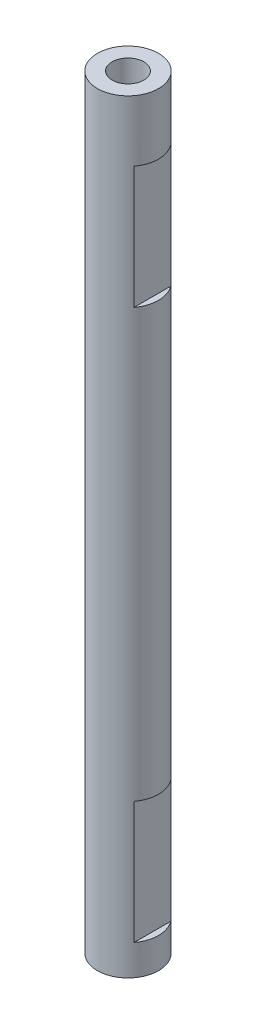
ISO-10303-21;
HEADER;
FILE_DESCRIPTION(('STEP AP214'),'2;1');
FILE_NAME('part.step','',(''),(''),'','','');
FILE_SCHEMA(('AUTOMOTIVE_DESIGN { 1 0 10303 214 1 1 1 1 }'));
ENDSEC;
DATA;
#1=APPLICATION_CONTEXT('core data for automotive mechanical design processes');
#2=APPLICATION_PROTOCOL_DEFINITION('international standard','automotive_design',2000,#1);
#3=PRODUCT_CONTEXT('',#1,'mechanical');
#4=PRODUCT('Part','Part','',(#3));
#5=PRODUCT_RELATED_PRODUCT_CATEGORY('part','',(#4));
#6=PRODUCT_DEFINITION_FORMATION('','',#4);
#7=PRODUCT_DEFINITION_CONTEXT('part definition',#1,'design');
#8=PRODUCT_DEFINITION('design','',#6,#7);
#9=PRODUCT_DEFINITION_SHAPE('','',#8);
#10=(LENGTH_UNIT() NAMED_UNIT(*) SI_UNIT(.MILLI.,.METRE.));
#11=(NAMED_UNIT(*) PLANE_ANGLE_UNIT() SI_UNIT($,.RADIAN.));
#12=(NAMED_UNIT(*) SI_UNIT($,.STERADIAN.) SOLID_ANGLE_UNIT());
#13=UNCERTAINTY_MEASURE_WITH_UNIT(LENGTH_MEASURE(1.E-05),#10,'distance_accuracy_value','');
#14=(GEOMETRIC_REPRESENTATION_CONTEXT(3) GLOBAL_UNCERTAINTY_ASSIGNED_CONTEXT((#13)) GLOBAL_UNIT_ASSIGNED_CONTEXT((#10,
#11,#12)) REPRESENTATION_CONTEXT('',''));
#15=CARTESIAN_POINT('',(0.,0.,0.));
#16=DIRECTION('',(0.,0.,1.));
#17=DIRECTION('',(1.,0.,0.));
#18=AXIS2_PLACEMENT_3D('',#15,#16,#17);
#19=CARTESIAN_POINT('',(0.,125.,0.));
#20=DIRECTION('',(0.,-1.,0.));
#21=DIRECTION('',(0.,0.,-1.));
#22=AXIS2_PLACEMENT_3D('',#19,#20,#21);
#23=CYLINDRICAL_SURFACE('',#22,5.);
#24=CARTESIAN_POINT('',(0.,25.,0.));
#25=DIRECTION('',(0.,-1.,0.));
#26=DIRECTION('',(0.,0.,-1.));
#27=AXIS2_PLACEMENT_3D('',#24,#25,#26);
#28=CIRCLE('',#27,5.);
#29=CARTESIAN_POINT('',(4.,25.,-3.));
#30=VERTEX_POINT('',#29);
#31=CARTESIAN_POINT('',(4.,25.,3.));
#32=VERTEX_POINT('',#31);
#33=EDGE_CURVE('E125',#30,#32,#28,.T.);
#34=ORIENTED_EDGE('',*,*,#33,.F.);
#35=DIRECTION('',(0.,-1.,0.));
#36=VECTOR('',#35,1.);
#37=CARTESIAN_POINT('',(4.,25.,-3.));
#38=LINE('',#37,#36);
#39=CARTESIAN_POINT('',(4.,5.,-3.));
#40=VERTEX_POINT('',#39);
#41=EDGE_CURVE('E134',#30,#40,#38,.T.);
#42=ORIENTED_EDGE('',*,*,#41,.T.);
#43=CARTESIAN_POINT('',(0.,5.,0.));
#44=DIRECTION('',(0.,-1.,0.));
#45=DIRECTION('',(0.,0.,-1.));
#46=AXIS2_PLACEMENT_3D('',#43,#44,#45);
#47=CIRCLE('',#46,5.);
#48=CARTESIAN_POINT('',(4.,5.,3.));
#49=VERTEX_POINT('',#48);
#50=EDGE_CURVE('E123',#40,#49,#47,.T.);
#51=ORIENTED_EDGE('',*,*,#50,.T.);
#52=DIRECTION('',(0.,-1.,0.));
#53=VECTOR('',#52,1.);
#54=CARTESIAN_POINT('',(4.,25.,3.));
#55=LINE('',#54,#53);
#56=EDGE_CURVE('E130',#32,#49,#55,.T.);
#57=ORIENTED_EDGE('',*,*,#56,.F.);
#58=EDGE_LOOP('',(#34,#42,#51,#57));
#59=FACE_BOUND('',#58,.T.);
#60=CARTESIAN_POINT('',(0.,95.,0.));
#61=DIRECTION('',(0.,1.,0.));
#62=DIRECTION('',(0.,0.,1.));
#63=AXIS2_PLACEMENT_3D('',#60,#61,#62);
#64=CIRCLE('',#63,5.);
#65=CARTESIAN_POINT('',(4.,95.,-3.00000000000001));
#66=VERTEX_POINT('',#65);
#67=CARTESIAN_POINT('',(4.,95.,3.00000000000001));
#68=VERTEX_POINT('',#67);
#69=EDGE_CURVE('E155',#66,#68,#64,.F.);
#70=ORIENTED_EDGE('',*,*,#69,.T.);
#71=DIRECTION('',(0.,1.,0.));
#72=VECTOR('',#71,1.);
#73=CARTESIAN_POINT('',(4.,95.,3.00000000000001));
#74=LINE('',#73,#72);
#75=CARTESIAN_POINT('',(4.,115.,3.00000000000001));
#76=VERTEX_POINT('',#75);
#77=EDGE_CURVE('E166',#68,#76,#74,.T.);
#78=ORIENTED_EDGE('',*,*,#77,.T.);
#79=CARTESIAN_POINT('',(0.,115.,0.));
#80=DIRECTION('',(0.,1.,0.));
#81=DIRECTION('',(0.,0.,1.));
#82=AXIS2_PLACEMENT_3D('',#79,#80,#81);
#83=CIRCLE('',#82,5.);
#84=CARTESIAN_POINT('',(4.,115.,-3.00000000000001));
#85=VERTEX_POINT('',#84);
#86=EDGE_CURVE('E152',#85,#76,#83,.F.);
#87=ORIENTED_EDGE('',*,*,#86,.F.);
#88=DIRECTION('',(0.,1.,0.));
#89=VECTOR('',#88,1.);
#90=CARTESIAN_POINT('',(4.,95.,-3.00000000000001));
#91=LINE('',#90,#89);
#92=EDGE_CURVE('E161',#66,#85,#91,.T.);
#93=ORIENTED_EDGE('',*,*,#92,.F.);
#94=EDGE_LOOP('',(#70,#78,#87,#93));
#95=FACE_BOUND('',#94,.T.);
#96=CARTESIAN_POINT('',(0.,125.,0.));
#97=DIRECTION('',(0.,1.,0.));
#98=DIRECTION('',(0.,0.,1.));
#99=AXIS2_PLACEMENT_3D('',#96,#97,#98);
#100=CIRCLE('',#99,5.);
#101=CARTESIAN_POINT('',(0.,125.,5.));
#102=VERTEX_POINT('',#101);
#103=EDGE_CURVE('E11',#102,#102,#100,.T.);
#104=ORIENTED_EDGE('',*,*,#103,.F.);
#105=EDGE_LOOP('',(#104));
#106=FACE_BOUND('',#105,.T.);
#107=CARTESIAN_POINT('',(0.,0.,0.));
#108=DIRECTION('',(0.,1.,0.));
#109=DIRECTION('',(0.,0.,1.));
#110=AXIS2_PLACEMENT_3D('',#107,#108,#109);
#111=CIRCLE('',#110,5.);
#112=CARTESIAN_POINT('',(0.,0.,5.));
#113=VERTEX_POINT('',#112);
#114=EDGE_CURVE('E37',#113,#113,#111,.T.);
#115=ORIENTED_EDGE('',*,*,#114,.T.);
#116=EDGE_LOOP('',(#115));
#117=FACE_BOUND('',#116,.T.);
#118=CARTESIAN_POINT('',(0.,95.,0.));
#119=DIRECTION('',(0.,1.,0.));
#120=DIRECTION('',(0.,0.,1.));
#121=AXIS2_PLACEMENT_3D('',#118,#119,#120);
#122=CIRCLE('',#121,5.);
#123=CARTESIAN_POINT('',(-4.,95.,-2.99999999999999));
#124=VERTEX_POINT('',#123);
#125=CARTESIAN_POINT('',(-4.,95.,2.99999999999999));
#126=VERTEX_POINT('',#125);
#127=EDGE_CURVE('E139',#124,#126,#122,.T.);
#128=ORIENTED_EDGE('',*,*,#127,.F.);
#129=DIRECTION('',(0.,1.,0.));
#130=VECTOR('',#129,1.);
#131=CARTESIAN_POINT('',(-4.,95.,-2.99999999999999));
#132=LINE('',#131,#130);
#133=CARTESIAN_POINT('',(-4.,115.,-2.99999999999999));
#134=VERTEX_POINT('',#133);
#135=EDGE_CURVE('E149',#124,#134,#132,.T.);
#136=ORIENTED_EDGE('',*,*,#135,.T.);
#137=CARTESIAN_POINT('',(0.,115.,0.));
#138=DIRECTION('',(0.,1.,0.));
#139=DIRECTION('',(0.,0.,1.));
#140=AXIS2_PLACEMENT_3D('',#137,#138,#139);
#141=CIRCLE('',#140,5.);
#142=CARTESIAN_POINT('',(-4.,115.,2.99999999999999));
#143=VERTEX_POINT('',#142);
#144=EDGE_CURVE('E137',#134,#143,#141,.T.);
#145=ORIENTED_EDGE('',*,*,#144,.T.);
#146=DIRECTION('',(0.,1.,0.));
#147=VECTOR('',#146,1.);
#148=CARTESIAN_POINT('',(-4.,95.,2.99999999999999));
#149=LINE('',#148,#147);
#150=EDGE_CURVE('E145',#126,#143,#149,.T.);
#151=ORIENTED_EDGE('',*,*,#150,.F.);
#152=EDGE_LOOP('',(#128,#136,#145,#151));
#153=FACE_BOUND('',#152,.T.);
#154=CARTESIAN_POINT('',(0.,25.,0.));
#155=DIRECTION('',(0.,-1.,0.));
#156=DIRECTION('',(0.,0.,-1.));
#157=AXIS2_PLACEMENT_3D('',#154,#155,#156);
#158=CIRCLE('',#157,5.);
#159=CARTESIAN_POINT('',(-4.,25.,-3.));
#160=VERTEX_POINT('',#159);
#161=CARTESIAN_POINT('',(-4.,25.,3.));
#162=VERTEX_POINT('',#161);
#163=EDGE_CURVE('E113',#160,#162,#158,.F.);
#164=ORIENTED_EDGE('',*,*,#163,.T.);
#165=DIRECTION('',(0.,-1.,0.));
#166=VECTOR('',#165,1.);
#167=CARTESIAN_POINT('',(-4.,25.,3.));
#168=LINE('',#167,#166);
#169=CARTESIAN_POINT('',(-4.,5.,3.));
#170=VERTEX_POINT('',#169);
#171=EDGE_CURVE('E104',#162,#170,#168,.T.);
#172=ORIENTED_EDGE('',*,*,#171,.T.);
#173=CARTESIAN_POINT('',(0.,5.,0.));
#174=DIRECTION('',(0.,-1.,0.));
#175=DIRECTION('',(0.,0.,-1.));
#176=AXIS2_PLACEMENT_3D('',#173,#174,#175);
#177=CIRCLE('',#176,5.);
#178=CARTESIAN_POINT('',(-4.,5.,-3.));
#179=VERTEX_POINT('',#178);
#180=EDGE_CURVE('E117',#179,#170,#177,.F.);
#181=ORIENTED_EDGE('',*,*,#180,.F.);
#182=DIRECTION('',(0.,-1.,0.));
#183=VECTOR('',#182,1.);
#184=CARTESIAN_POINT('',(-4.,25.,-3.));
#185=LINE('',#184,#183);
#186=EDGE_CURVE('E112',#160,#179,#185,.T.);
#187=ORIENTED_EDGE('',*,*,#186,.F.);
#188=EDGE_LOOP('',(#164,#172,#181,#187));
#189=FACE_BOUND('',#188,.T.);
#190=ADVANCED_FACE('F34',(#59,#95,#106,#117,#153,#189),#23,.T.);
#191=CARTESIAN_POINT('',(0.,125.,0.));
#192=DIRECTION('',(0.,1.,0.));
#193=DIRECTION('',(0.,0.,1.));
#194=AXIS2_PLACEMENT_3D('',#191,#192,#193);
#195=PLANE('',#194);
#196=CARTESIAN_POINT('',(0.,125.,0.));
#197=DIRECTION('',(0.,1.,0.));
#198=DIRECTION('',(0.,0.,1.));
#199=AXIS2_PLACEMENT_3D('',#196,#197,#198);
#200=CIRCLE('',#199,2.6);
#201=CARTESIAN_POINT('',(0.,125.,2.6));
#202=VERTEX_POINT('',#201);
#203=EDGE_CURVE('E176',#202,#202,#200,.T.);
#204=ORIENTED_EDGE('',*,*,#203,.F.);
#205=EDGE_LOOP('',(#204));
#206=FACE_BOUND('',#205,.T.);
#207=ORIENTED_EDGE('',*,*,#103,.T.);
#208=EDGE_LOOP('',(#207));
#209=FACE_BOUND('',#208,.T.);
#210=ADVANCED_FACE('F191',(#206,#209),#195,.T.);
#211=CARTESIAN_POINT('',(0.,0.,0.));
#212=DIRECTION('',(0.,1.,0.));
#213=DIRECTION('',(0.,0.,1.));
#214=AXIS2_PLACEMENT_3D('',#211,#212,#213);
#215=PLANE('',#214);
#216=CARTESIAN_POINT('',(0.,0.,0.));
#217=DIRECTION('',(0.,-1.,0.));
#218=DIRECTION('',(0.,0.,-1.));
#219=AXIS2_PLACEMENT_3D('',#216,#217,#218);
#220=CIRCLE('',#219,2.59999999999999);
#221=CARTESIAN_POINT('',(0.,0.,-2.59999999999999));
#222=VERTEX_POINT('',#221);
#223=EDGE_CURVE('E169',#222,#222,#220,.T.);
#224=ORIENTED_EDGE('',*,*,#223,.F.);
#225=EDGE_LOOP('',(#224));
#226=FACE_BOUND('',#225,.T.);
#227=ORIENTED_EDGE('',*,*,#114,.F.);
#228=EDGE_LOOP('',(#227));
#229=FACE_BOUND('',#228,.T.);
#230=ADVANCED_FACE('F188',(#226,#229),#215,.F.);
#231=CARTESIAN_POINT('',(0.,109.,0.));
#232=DIRECTION('',(0.,1.,0.));
#233=DIRECTION('',(0.,0.,1.));
#234=AXIS2_PLACEMENT_3D('',#231,#232,#233);
#235=CONICAL_SURFACE('',#234,2.6,1.02974425867665);
#236=CARTESIAN_POINT('',(0.,107.437762390528,0.));
#237=VERTEX_POINT('',#236);
#238=VERTEX_LOOP('',#237);
#239=FACE_BOUND('',#238,.T.);
#240=CARTESIAN_POINT('',(0.,109.,0.));
#241=DIRECTION('',(0.,1.,0.));
#242=DIRECTION('',(0.,0.,1.));
#243=AXIS2_PLACEMENT_3D('',#240,#241,#242);
#244=CIRCLE('',#243,2.6);
#245=CARTESIAN_POINT('',(0.,109.,2.6));
#246=VERTEX_POINT('',#245);
#247=EDGE_CURVE('E179',#246,#246,#244,.T.);
#248=ORIENTED_EDGE('',*,*,#247,.T.);
#249=EDGE_LOOP('',(#248));
#250=FACE_BOUND('',#249,.T.);
#251=ADVANCED_FACE('F190',(#239,#250),#235,.F.);
#252=CARTESIAN_POINT('',(0.,125.,0.));
#253=DIRECTION('',(0.,1.,0.));
#254=DIRECTION('',(0.,0.,1.));
#255=AXIS2_PLACEMENT_3D('',#252,#253,#254);
#256=CYLINDRICAL_SURFACE('',#255,2.6);
#257=ORIENTED_EDGE('',*,*,#247,.F.);
#258=EDGE_LOOP('',(#257));
#259=FACE_BOUND('',#258,.T.);
#260=ORIENTED_EDGE('',*,*,#203,.T.);
#261=EDGE_LOOP('',(#260));
#262=FACE_BOUND('',#261,.T.);
#263=ADVANCED_FACE('F197',(#259,#262),#256,.F.);
#264=CARTESIAN_POINT('',(0.,16.,0.));
#265=DIRECTION('',(0.,-1.,0.));
#266=DIRECTION('',(0.,0.,-1.));
#267=AXIS2_PLACEMENT_3D('',#264,#265,#266);
#268=CONICAL_SURFACE('',#267,2.59999999999999,1.02974425867665);
#269=CARTESIAN_POINT('',(0.,17.5622376094716,0.));
#270=VERTEX_POINT('',#269);
#271=VERTEX_LOOP('',#270);
#272=FACE_BOUND('',#271,.T.);
#273=CARTESIAN_POINT('',(0.,16.,0.));
#274=DIRECTION('',(0.,-1.,0.));
#275=DIRECTION('',(0.,0.,-1.));
#276=AXIS2_PLACEMENT_3D('',#273,#274,#275);
#277=CIRCLE('',#276,2.59999999999999);
#278=CARTESIAN_POINT('',(0.,16.,-2.59999999999999));
#279=VERTEX_POINT('',#278);
#280=EDGE_CURVE('E173',#279,#279,#277,.T.);
#281=ORIENTED_EDGE('',*,*,#280,.T.);
#282=EDGE_LOOP('',(#281));
#283=FACE_BOUND('',#282,.T.);
#284=ADVANCED_FACE('F240',(#272,#283),#268,.F.);
#285=CARTESIAN_POINT('',(0.,0.,0.));
#286=DIRECTION('',(0.,-1.,0.));
#287=DIRECTION('',(0.,0.,-1.));
#288=AXIS2_PLACEMENT_3D('',#285,#286,#287);
#289=CYLINDRICAL_SURFACE('',#288,2.59999999999999);
#290=ORIENTED_EDGE('',*,*,#280,.F.);
#291=EDGE_LOOP('',(#290));
#292=FACE_BOUND('',#291,.T.);
#293=ORIENTED_EDGE('',*,*,#223,.T.);
#294=EDGE_LOOP('',(#293));
#295=FACE_BOUND('',#294,.T.);
#296=ADVANCED_FACE('F237',(#292,#295),#289,.F.);
#297=CARTESIAN_POINT('',(4.,95.,0.));
#298=DIRECTION('',(1.,0.,0.));
#299=DIRECTION('',(0.,0.,-1.));
#300=AXIS2_PLACEMENT_3D('',#297,#298,#299);
#301=PLANE('',#300);
#302=DIRECTION('',(0.,0.,-1.));
#303=VECTOR('',#302,1.);
#304=CARTESIAN_POINT('',(4.,115.,0.));
#305=LINE('',#304,#303);
#306=EDGE_CURVE('E159',#76,#85,#305,.T.);
#307=ORIENTED_EDGE('',*,*,#306,.F.);
#308=ORIENTED_EDGE('',*,*,#77,.F.);
#309=DIRECTION('',(0.,0.,-1.));
#310=VECTOR('',#309,1.);
#311=CARTESIAN_POINT('',(4.,95.,0.));
#312=LINE('',#311,#310);
#313=EDGE_CURVE('E158',#68,#66,#312,.T.);
#314=ORIENTED_EDGE('',*,*,#313,.T.);
#315=ORIENTED_EDGE('',*,*,#92,.T.);
#316=EDGE_LOOP('',(#307,#308,#314,#315));
#317=FACE_BOUND('',#316,.T.);
#318=ADVANCED_FACE('F220',(#317),#301,.T.);
#319=CARTESIAN_POINT('',(0.,95.,0.));
#320=DIRECTION('',(0.,1.,0.));
#321=DIRECTION('',(0.,0.,1.));
#322=AXIS2_PLACEMENT_3D('',#319,#320,#321);
#323=PLANE('',#322);
#324=ORIENTED_EDGE('',*,*,#69,.F.);
#325=ORIENTED_EDGE('',*,*,#313,.F.);
#326=EDGE_LOOP('',(#324,#325));
#327=FACE_BOUND('',#326,.T.);
#328=ADVANCED_FACE('F218',(#327),#323,.T.);
#329=CARTESIAN_POINT('',(0.,115.,0.));
#330=DIRECTION('',(0.,1.,0.));
#331=DIRECTION('',(0.,0.,1.));
#332=AXIS2_PLACEMENT_3D('',#329,#330,#331);
#333=PLANE('',#332);
#334=ORIENTED_EDGE('',*,*,#86,.T.);
#335=ORIENTED_EDGE('',*,*,#306,.T.);
#336=EDGE_LOOP('',(#334,#335));
#337=FACE_BOUND('',#336,.T.);
#338=ADVANCED_FACE('F222',(#337),#333,.F.);
#339=CARTESIAN_POINT('',(-4.,95.,0.));
#340=DIRECTION('',(-1.,0.,0.));
#341=DIRECTION('',(0.,0.,1.));
#342=AXIS2_PLACEMENT_3D('',#339,#340,#341);
#343=PLANE('',#342);
#344=DIRECTION('',(0.,0.,1.));
#345=VECTOR('',#344,1.);
#346=CARTESIAN_POINT('',(-4.,115.,0.));
#347=LINE('',#346,#345);
#348=EDGE_CURVE('E143',#134,#143,#347,.T.);
#349=ORIENTED_EDGE('',*,*,#348,.F.);
#350=ORIENTED_EDGE('',*,*,#135,.F.);
#351=DIRECTION('',(0.,0.,1.));
#352=VECTOR('',#351,1.);
#353=CARTESIAN_POINT('',(-4.,95.,0.));
#354=LINE('',#353,#352);
#355=EDGE_CURVE('E142',#124,#126,#354,.T.);
#356=ORIENTED_EDGE('',*,*,#355,.T.);
#357=ORIENTED_EDGE('',*,*,#150,.T.);
#358=EDGE_LOOP('',(#349,#350,#356,#357));
#359=FACE_BOUND('',#358,.T.);
#360=ADVANCED_FACE('F224',(#359),#343,.T.);
#361=CARTESIAN_POINT('',(0.,95.,0.));
#362=DIRECTION('',(0.,1.,0.));
#363=DIRECTION('',(0.,0.,1.));
#364=AXIS2_PLACEMENT_3D('',#361,#362,#363);
#365=PLANE('',#364);
#366=ORIENTED_EDGE('',*,*,#127,.T.);
#367=ORIENTED_EDGE('',*,*,#355,.F.);
#368=EDGE_LOOP('',(#366,#367));
#369=FACE_BOUND('',#368,.T.);
#370=ADVANCED_FACE('F230',(#369),#365,.T.);
#371=CARTESIAN_POINT('',(0.,115.,0.));
#372=DIRECTION('',(0.,1.,0.));
#373=DIRECTION('',(0.,0.,1.));
#374=AXIS2_PLACEMENT_3D('',#371,#372,#373);
#375=PLANE('',#374);
#376=ORIENTED_EDGE('',*,*,#144,.F.);
#377=ORIENTED_EDGE('',*,*,#348,.T.);
#378=EDGE_LOOP('',(#376,#377));
#379=FACE_BOUND('',#378,.T.);
#380=ADVANCED_FACE('F289',(#379),#375,.F.);
#381=CARTESIAN_POINT('',(4.,25.,0.));
#382=DIRECTION('',(1.,0.,0.));
#383=DIRECTION('',(0.,0.,-1.));
#384=AXIS2_PLACEMENT_3D('',#381,#382,#383);
#385=PLANE('',#384);
#386=DIRECTION('',(0.,0.,1.));
#387=VECTOR('',#386,1.);
#388=CARTESIAN_POINT('',(4.,5.,0.));
#389=LINE('',#388,#387);
#390=EDGE_CURVE('E54',#40,#49,#389,.T.);
#391=ORIENTED_EDGE('',*,*,#390,.F.);
#392=ORIENTED_EDGE('',*,*,#41,.F.);
#393=DIRECTION('',(0.,0.,1.));
#394=VECTOR('',#393,1.);
#395=CARTESIAN_POINT('',(4.,25.,0.));
#396=LINE('',#395,#394);
#397=EDGE_CURVE('E128',#30,#32,#396,.T.);
#398=ORIENTED_EDGE('',*,*,#397,.T.);
#399=ORIENTED_EDGE('',*,*,#56,.T.);
#400=EDGE_LOOP('',(#391,#392,#398,#399));
#401=FACE_BOUND('',#400,.T.);
#402=ADVANCED_FACE('F299',(#401),#385,.T.);
#403=CARTESIAN_POINT('',(0.,25.,0.));
#404=DIRECTION('',(0.,-1.,0.));
#405=DIRECTION('',(0.,0.,-1.));
#406=AXIS2_PLACEMENT_3D('',#403,#404,#405);
#407=PLANE('',#406);
#408=ORIENTED_EDGE('',*,*,#33,.T.);
#409=ORIENTED_EDGE('',*,*,#397,.F.);
#410=EDGE_LOOP('',(#408,#409));
#411=FACE_BOUND('',#410,.T.);
#412=ADVANCED_FACE('F314',(#411),#407,.T.);
#413=CARTESIAN_POINT('',(0.,5.,0.));
#414=DIRECTION('',(0.,-1.,0.));
#415=DIRECTION('',(0.,0.,-1.));
#416=AXIS2_PLACEMENT_3D('',#413,#414,#415);
#417=PLANE('',#416);
#418=ORIENTED_EDGE('',*,*,#50,.F.);
#419=ORIENTED_EDGE('',*,*,#390,.T.);
#420=EDGE_LOOP('',(#418,#419));
#421=FACE_BOUND('',#420,.T.);
#422=ADVANCED_FACE('F325',(#421),#417,.F.);
#423=CARTESIAN_POINT('',(-4.,25.,0.));
#424=DIRECTION('',(-1.,0.,0.));
#425=DIRECTION('',(0.,0.,1.));
#426=AXIS2_PLACEMENT_3D('',#423,#424,#425);
#427=PLANE('',#426);
#428=DIRECTION('',(0.,0.,-1.));
#429=VECTOR('',#428,1.);
#430=CARTESIAN_POINT('',(-4.,5.,0.));
#431=LINE('',#430,#429);
#432=EDGE_CURVE('E47',#170,#179,#431,.T.);
#433=ORIENTED_EDGE('',*,*,#432,.F.);
#434=ORIENTED_EDGE('',*,*,#171,.F.);
#435=DIRECTION('',(0.,0.,-1.));
#436=VECTOR('',#435,1.);
#437=CARTESIAN_POINT('',(-4.,25.,0.));
#438=LINE('',#437,#436);
#439=EDGE_CURVE('E107',#162,#160,#438,.T.);
#440=ORIENTED_EDGE('',*,*,#439,.T.);
#441=ORIENTED_EDGE('',*,*,#186,.T.);
#442=EDGE_LOOP('',(#433,#434,#440,#441));
#443=FACE_BOUND('',#442,.T.);
#444=ADVANCED_FACE('F106',(#443),#427,.T.);
#445=CARTESIAN_POINT('',(0.,25.,0.));
#446=DIRECTION('',(0.,-1.,0.));
#447=DIRECTION('',(0.,0.,-1.));
#448=AXIS2_PLACEMENT_3D('',#445,#446,#447);
#449=PLANE('',#448);
#450=ORIENTED_EDGE('',*,*,#439,.F.);
#451=ORIENTED_EDGE('',*,*,#163,.F.);
#452=EDGE_LOOP('',(#450,#451));
#453=FACE_BOUND('',#452,.T.);
#454=ADVANCED_FACE('F116',(#453),#449,.T.);
#455=CARTESIAN_POINT('',(0.,5.,0.));
#456=DIRECTION('',(0.,-1.,0.));
#457=DIRECTION('',(0.,0.,-1.));
#458=AXIS2_PLACEMENT_3D('',#455,#456,#457);
#459=PLANE('',#458);
#460=ORIENTED_EDGE('',*,*,#432,.T.);
#461=ORIENTED_EDGE('',*,*,#180,.T.);
#462=EDGE_LOOP('',(#460,#461));
#463=FACE_BOUND('',#462,.T.);
#464=ADVANCED_FACE('F353',(#463),#459,.F.);
#465=CLOSED_SHELL('',(#190,#210,#230,#251,#263,#284,#296,#318,#328,#338,#360,#370,#380,#402,
#412,#422,#444,#454,#464));
#466=MANIFOLD_SOLID_BREP('B2',#465);
#467=ADVANCED_BREP_SHAPE_REPRESENTATION('',(#18,#466),#14);
#468=SHAPE_DEFINITION_REPRESENTATION(#9,#467);
ENDSEC;
END-ISO-10303-21;
